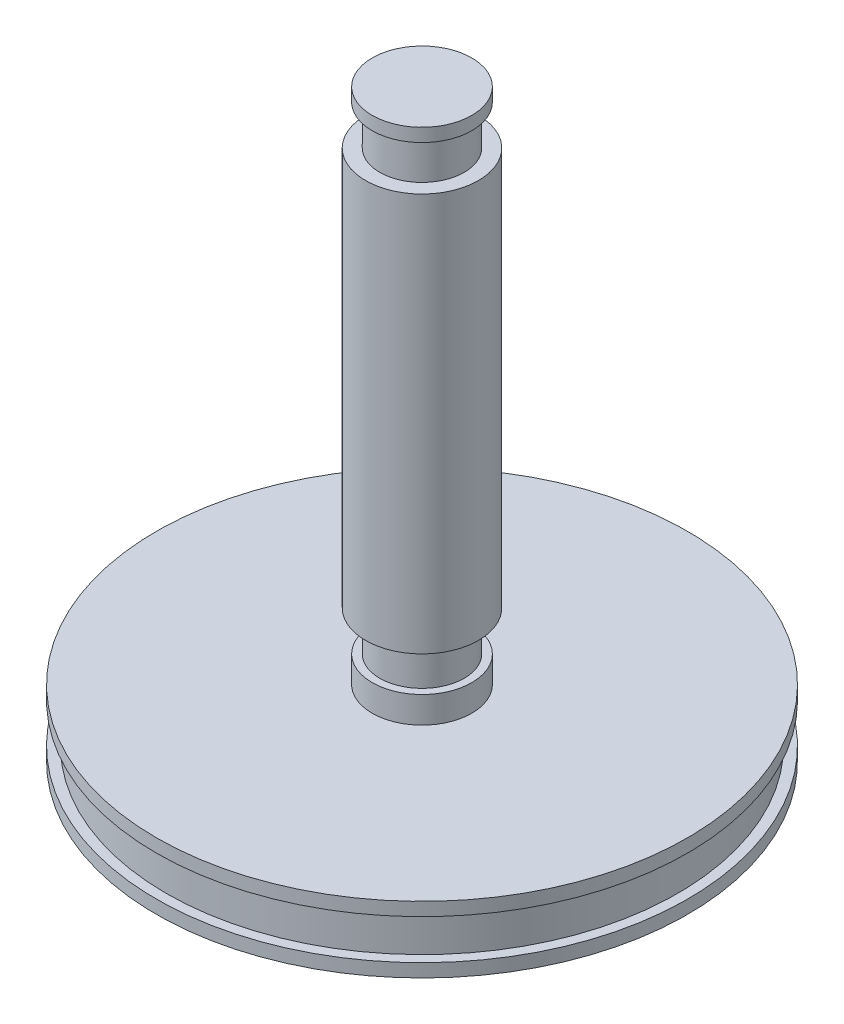
ISO-10303-21;
HEADER;
FILE_DESCRIPTION(('STEP AP214'),'2;1');
FILE_NAME('part.step','',(''),(''),'','','');
FILE_SCHEMA(('AUTOMOTIVE_DESIGN { 1 0 10303 214 1 1 1 1 }'));
ENDSEC;
DATA;
#1=APPLICATION_CONTEXT('core data for automotive mechanical design processes');
#2=APPLICATION_PROTOCOL_DEFINITION('international standard','automotive_design',2000,#1);
#3=PRODUCT_CONTEXT('',#1,'mechanical');
#4=PRODUCT('Part','Part','',(#3));
#5=PRODUCT_RELATED_PRODUCT_CATEGORY('part','',(#4));
#6=PRODUCT_DEFINITION_FORMATION('','',#4);
#7=PRODUCT_DEFINITION_CONTEXT('part definition',#1,'design');
#8=PRODUCT_DEFINITION('design','',#6,#7);
#9=PRODUCT_DEFINITION_SHAPE('','',#8);
#10=(LENGTH_UNIT() NAMED_UNIT(*) SI_UNIT(.MILLI.,.METRE.));
#11=(NAMED_UNIT(*) PLANE_ANGLE_UNIT() SI_UNIT($,.RADIAN.));
#12=(NAMED_UNIT(*) SI_UNIT($,.STERADIAN.) SOLID_ANGLE_UNIT());
#13=UNCERTAINTY_MEASURE_WITH_UNIT(LENGTH_MEASURE(1.E-05),#10,'distance_accuracy_value','');
#14=(GEOMETRIC_REPRESENTATION_CONTEXT(3) GLOBAL_UNCERTAINTY_ASSIGNED_CONTEXT((#13)) GLOBAL_UNIT_ASSIGNED_CONTEXT((#10,
#11,#12)) REPRESENTATION_CONTEXT('',''));
#15=CARTESIAN_POINT('',(0.,0.,0.));
#16=DIRECTION('',(0.,0.,1.));
#17=DIRECTION('',(1.,0.,0.));
#18=AXIS2_PLACEMENT_3D('',#15,#16,#17);
#19=CARTESIAN_POINT('',(0.,88.,0.));
#20=DIRECTION('',(0.,-1.,0.));
#21=DIRECTION('',(0.,0.,-1.));
#22=AXIS2_PLACEMENT_3D('',#19,#20,#21);
#23=CYLINDRICAL_SURFACE('',#22,6.366);
#24=CARTESIAN_POINT('',(0.,14.,0.));
#25=DIRECTION('',(0.,1.,0.));
#26=DIRECTION('',(0.,0.,1.));
#27=AXIS2_PLACEMENT_3D('',#24,#25,#26);
#28=CIRCLE('',#27,6.366);
#29=CARTESIAN_POINT('',(0.,14.,6.366));
#30=VERTEX_POINT('',#29);
#31=EDGE_CURVE('E36',#30,#30,#28,.T.);
#32=ORIENTED_EDGE('',*,*,#31,.T.);
#33=EDGE_LOOP('',(#32));
#34=FACE_BOUND('',#33,.T.);
#35=CARTESIAN_POINT('',(0.,20.,0.));
#36=DIRECTION('',(0.,-1.,0.));
#37=DIRECTION('',(0.,0.,-1.));
#38=AXIS2_PLACEMENT_3D('',#35,#36,#37);
#39=CIRCLE('',#38,6.366);
#40=CARTESIAN_POINT('',(0.,20.,-6.366));
#41=VERTEX_POINT('',#40);
#42=EDGE_CURVE('E48',#41,#41,#39,.T.);
#43=ORIENTED_EDGE('',*,*,#42,.T.);
#44=EDGE_LOOP('',(#43));
#45=FACE_BOUND('',#44,.T.);
#46=ADVANCED_FACE('F32',(#34,#45),#23,.T.);
#47=CARTESIAN_POINT('',(0.,20.,0.));
#48=DIRECTION('',(0.,1.,0.));
#49=DIRECTION('',(0.,0.,1.));
#50=AXIS2_PLACEMENT_3D('',#47,#48,#49);
#51=CYLINDRICAL_SURFACE('',#50,8.5);
#52=CARTESIAN_POINT('',(0.,20.,0.));
#53=DIRECTION('',(0.,-1.,0.));
#54=DIRECTION('',(0.,0.,-1.));
#55=AXIS2_PLACEMENT_3D('',#52,#53,#54);
#56=CIRCLE('',#55,8.5);
#57=CARTESIAN_POINT('',(0.,20.,-8.5));
#58=VERTEX_POINT('',#57);
#59=EDGE_CURVE('E51',#58,#58,#56,.T.);
#60=ORIENTED_EDGE('',*,*,#59,.F.);
#61=EDGE_LOOP('',(#60));
#62=FACE_BOUND('',#61,.T.);
#63=CARTESIAN_POINT('',(0.,80.,0.));
#64=DIRECTION('',(0.,-1.,0.));
#65=DIRECTION('',(0.,0.,-1.));
#66=AXIS2_PLACEMENT_3D('',#63,#64,#65);
#67=CIRCLE('',#66,8.5);
#68=CARTESIAN_POINT('',(0.,80.,-8.5));
#69=VERTEX_POINT('',#68);
#70=EDGE_CURVE('E58',#69,#69,#67,.T.);
#71=ORIENTED_EDGE('',*,*,#70,.T.);
#72=EDGE_LOOP('',(#71));
#73=FACE_BOUND('',#72,.T.);
#74=ADVANCED_FACE('F104',(#62,#73),#51,.T.);
#75=CARTESIAN_POINT('',(0.,20.,0.));
#76=DIRECTION('',(0.,-1.,0.));
#77=DIRECTION('',(0.,0.,-1.));
#78=AXIS2_PLACEMENT_3D('',#75,#76,#77);
#79=PLANE('',#78);
#80=ORIENTED_EDGE('',*,*,#42,.F.);
#81=EDGE_LOOP('',(#80));
#82=FACE_BOUND('',#81,.T.);
#83=ORIENTED_EDGE('',*,*,#59,.T.);
#84=EDGE_LOOP('',(#83));
#85=FACE_BOUND('',#84,.T.);
#86=ADVANCED_FACE('F111',(#82,#85),#79,.T.);
#87=CARTESIAN_POINT('',(0.,80.,0.));
#88=DIRECTION('',(0.,-1.,0.));
#89=DIRECTION('',(0.,0.,-1.));
#90=AXIS2_PLACEMENT_3D('',#87,#88,#89);
#91=PLANE('',#90);
#92=CARTESIAN_POINT('',(0.,80.,0.));
#93=DIRECTION('',(0.,-1.,0.));
#94=DIRECTION('',(0.,0.,-1.));
#95=AXIS2_PLACEMENT_3D('',#92,#93,#94);
#96=CIRCLE('',#95,6.366);
#97=CARTESIAN_POINT('',(0.,80.,-6.366));
#98=VERTEX_POINT('',#97);
#99=EDGE_CURVE('E10',#98,#98,#96,.T.);
#100=ORIENTED_EDGE('',*,*,#99,.T.);
#101=EDGE_LOOP('',(#100));
#102=FACE_BOUND('',#101,.T.);
#103=ORIENTED_EDGE('',*,*,#70,.F.);
#104=EDGE_LOOP('',(#103));
#105=FACE_BOUND('',#104,.T.);
#106=ADVANCED_FACE('F142',(#102,#105),#91,.F.);
#107=CARTESIAN_POINT('',(0.,88.,0.));
#108=DIRECTION('',(0.,1.,0.));
#109=DIRECTION('',(0.,0.,1.));
#110=AXIS2_PLACEMENT_3D('',#107,#108,#109);
#111=PLANE('',#110);
#112=CARTESIAN_POINT('',(0.,88.,0.));
#113=DIRECTION('',(0.,1.,0.));
#114=DIRECTION('',(0.,0.,1.));
#115=AXIS2_PLACEMENT_3D('',#112,#113,#114);
#116=CIRCLE('',#115,7.5);
#117=CARTESIAN_POINT('',(0.,88.,7.5));
#118=VERTEX_POINT('',#117);
#119=EDGE_CURVE('E50',#118,#118,#116,.T.);
#120=ORIENTED_EDGE('',*,*,#119,.T.);
#121=EDGE_LOOP('',(#120));
#122=FACE_BOUND('',#121,.T.);
#123=ADVANCED_FACE('F137',(#122),#111,.T.);
#124=CARTESIAN_POINT('',(0.,86.,0.));
#125=DIRECTION('',(0.,1.,0.));
#126=DIRECTION('',(0.,0.,1.));
#127=AXIS2_PLACEMENT_3D('',#124,#125,#126);
#128=CYLINDRICAL_SURFACE('',#127,7.5);
#129=CARTESIAN_POINT('',(0.,86.,0.));
#130=DIRECTION('',(0.,1.,0.));
#131=DIRECTION('',(0.,0.,1.));
#132=AXIS2_PLACEMENT_3D('',#129,#130,#131);
#133=CIRCLE('',#132,7.5);
#134=CARTESIAN_POINT('',(0.,86.,7.5));
#135=VERTEX_POINT('',#134);
#136=EDGE_CURVE('E55',#135,#135,#133,.T.);
#137=ORIENTED_EDGE('',*,*,#136,.T.);
#138=EDGE_LOOP('',(#137));
#139=FACE_BOUND('',#138,.T.);
#140=ORIENTED_EDGE('',*,*,#119,.F.);
#141=EDGE_LOOP('',(#140));
#142=FACE_BOUND('',#141,.T.);
#143=ADVANCED_FACE('F127',(#139,#142),#128,.T.);
#144=CARTESIAN_POINT('',(0.,86.,0.));
#145=DIRECTION('',(0.,1.,0.));
#146=DIRECTION('',(0.,0.,1.));
#147=AXIS2_PLACEMENT_3D('',#144,#145,#146);
#148=PLANE('',#147);
#149=CARTESIAN_POINT('',(0.,86.,0.));
#150=DIRECTION('',(0.,1.,0.));
#151=DIRECTION('',(0.,0.,1.));
#152=AXIS2_PLACEMENT_3D('',#149,#150,#151);
#153=CIRCLE('',#152,6.366);
#154=CARTESIAN_POINT('',(0.,86.,6.366));
#155=VERTEX_POINT('',#154);
#156=EDGE_CURVE('E40',#155,#155,#153,.T.);
#157=ORIENTED_EDGE('',*,*,#156,.T.);
#158=EDGE_LOOP('',(#157));
#159=FACE_BOUND('',#158,.T.);
#160=ORIENTED_EDGE('',*,*,#136,.F.);
#161=EDGE_LOOP('',(#160));
#162=FACE_BOUND('',#161,.T.);
#163=ADVANCED_FACE('F118',(#159,#162),#148,.F.);
#164=ORIENTED_EDGE('',*,*,#156,.F.);
#165=EDGE_LOOP('',(#164));
#166=FACE_BOUND('',#165,.T.);
#167=ORIENTED_EDGE('',*,*,#99,.F.);
#168=EDGE_LOOP('',(#167));
#169=FACE_BOUND('',#168,.T.);
#170=ADVANCED_FACE('F107',(#166,#169),#23,.T.);
#171=CARTESIAN_POINT('',(0.,14.,0.));
#172=DIRECTION('',(0.,-1.,0.));
#173=DIRECTION('',(0.,0.,-1.));
#174=AXIS2_PLACEMENT_3D('',#171,#172,#173);
#175=CYLINDRICAL_SURFACE('',#174,7.5);
#176=CARTESIAN_POINT('',(0.,14.,0.));
#177=DIRECTION('',(0.,1.,0.));
#178=DIRECTION('',(0.,0.,1.));
#179=AXIS2_PLACEMENT_3D('',#176,#177,#178);
#180=CIRCLE('',#179,7.5);
#181=CARTESIAN_POINT('',(0.,14.,7.5));
#182=VERTEX_POINT('',#181);
#183=EDGE_CURVE('E162',#182,#182,#180,.T.);
#184=ORIENTED_EDGE('',*,*,#183,.F.);
#185=EDGE_LOOP('',(#184));
#186=FACE_BOUND('',#185,.T.);
#187=CARTESIAN_POINT('',(0.,10.,0.));
#188=DIRECTION('',(0.,1.,0.));
#189=DIRECTION('',(0.,0.,1.));
#190=AXIS2_PLACEMENT_3D('',#187,#188,#189);
#191=CIRCLE('',#190,7.5);
#192=CARTESIAN_POINT('',(0.,10.,7.5));
#193=VERTEX_POINT('',#192);
#194=EDGE_CURVE('E65',#193,#193,#191,.T.);
#195=ORIENTED_EDGE('',*,*,#194,.T.);
#196=EDGE_LOOP('',(#195));
#197=FACE_BOUND('',#196,.T.);
#198=ADVANCED_FACE('F117',(#186,#197),#175,.T.);
#199=CARTESIAN_POINT('',(0.,14.,0.));
#200=DIRECTION('',(0.,1.,0.));
#201=DIRECTION('',(0.,0.,1.));
#202=AXIS2_PLACEMENT_3D('',#199,#200,#201);
#203=PLANE('',#202);
#204=ORIENTED_EDGE('',*,*,#31,.F.);
#205=EDGE_LOOP('',(#204));
#206=FACE_BOUND('',#205,.T.);
#207=ORIENTED_EDGE('',*,*,#183,.T.);
#208=EDGE_LOOP('',(#207));
#209=FACE_BOUND('',#208,.T.);
#210=ADVANCED_FACE('F124',(#206,#209),#203,.T.);
#211=CARTESIAN_POINT('',(0.,0.,0.));
#212=DIRECTION('',(0.,1.,0.));
#213=DIRECTION('',(0.,0.,1.));
#214=AXIS2_PLACEMENT_3D('',#211,#212,#213);
#215=PLANE('',#214);
#216=CARTESIAN_POINT('',(0.,0.,0.));
#217=DIRECTION('',(0.,-1.,0.));
#218=DIRECTION('',(0.,0.,-1.));
#219=AXIS2_PLACEMENT_3D('',#216,#217,#218);
#220=CIRCLE('',#219,40.);
#221=CARTESIAN_POINT('',(0.,0.,-40.));
#222=VERTEX_POINT('',#221);
#223=EDGE_CURVE('E74',#222,#222,#220,.T.);
#224=ORIENTED_EDGE('',*,*,#223,.T.);
#225=EDGE_LOOP('',(#224));
#226=FACE_BOUND('',#225,.T.);
#227=ADVANCED_FACE('F152',(#226),#215,.F.);
#228=CARTESIAN_POINT('',(0.,2.,0.));
#229=DIRECTION('',(0.,-1.,0.));
#230=DIRECTION('',(0.,0.,-1.));
#231=AXIS2_PLACEMENT_3D('',#228,#229,#230);
#232=CYLINDRICAL_SURFACE('',#231,40.);
#233=CARTESIAN_POINT('',(0.,2.,0.));
#234=DIRECTION('',(0.,-1.,0.));
#235=DIRECTION('',(0.,0.,-1.));
#236=AXIS2_PLACEMENT_3D('',#233,#234,#235);
#237=CIRCLE('',#236,40.);
#238=CARTESIAN_POINT('',(0.,2.,-40.));
#239=VERTEX_POINT('',#238);
#240=EDGE_CURVE('E77',#239,#239,#237,.T.);
#241=ORIENTED_EDGE('',*,*,#240,.T.);
#242=EDGE_LOOP('',(#241));
#243=FACE_BOUND('',#242,.T.);
#244=ORIENTED_EDGE('',*,*,#223,.F.);
#245=EDGE_LOOP('',(#244));
#246=FACE_BOUND('',#245,.T.);
#247=ADVANCED_FACE('F99',(#243,#246),#232,.T.);
#248=CARTESIAN_POINT('',(0.,2.,0.));
#249=DIRECTION('',(0.,-1.,0.));
#250=DIRECTION('',(0.,0.,-1.));
#251=AXIS2_PLACEMENT_3D('',#248,#249,#250);
#252=PLANE('',#251);
#253=CARTESIAN_POINT('',(0.,2.,0.));
#254=DIRECTION('',(0.,-1.,0.));
#255=DIRECTION('',(0.,0.,-1.));
#256=AXIS2_PLACEMENT_3D('',#253,#254,#255);
#257=CIRCLE('',#256,38.515);
#258=CARTESIAN_POINT('',(0.,2.,-38.515));
#259=VERTEX_POINT('',#258);
#260=EDGE_CURVE('E80',#259,#259,#257,.T.);
#261=ORIENTED_EDGE('',*,*,#260,.T.);
#262=EDGE_LOOP('',(#261));
#263=FACE_BOUND('',#262,.T.);
#264=ORIENTED_EDGE('',*,*,#240,.F.);
#265=EDGE_LOOP('',(#264));
#266=FACE_BOUND('',#265,.T.);
#267=ADVANCED_FACE('F91',(#263,#266),#252,.F.);
#268=CARTESIAN_POINT('',(0.,10.,0.));
#269=DIRECTION('',(0.,-1.,0.));
#270=DIRECTION('',(0.,0.,-1.));
#271=AXIS2_PLACEMENT_3D('',#268,#269,#270);
#272=CYLINDRICAL_SURFACE('',#271,38.515);
#273=ORIENTED_EDGE('',*,*,#260,.F.);
#274=EDGE_LOOP('',(#273));
#275=FACE_BOUND('',#274,.T.);
#276=CARTESIAN_POINT('',(0.,8.,0.));
#277=DIRECTION('',(0.,1.,0.));
#278=DIRECTION('',(0.,0.,1.));
#279=AXIS2_PLACEMENT_3D('',#276,#277,#278);
#280=CIRCLE('',#279,38.515);
#281=CARTESIAN_POINT('',(0.,8.,38.515));
#282=VERTEX_POINT('',#281);
#283=EDGE_CURVE('E45',#282,#282,#280,.T.);
#284=ORIENTED_EDGE('',*,*,#283,.F.);
#285=EDGE_LOOP('',(#284));
#286=FACE_BOUND('',#285,.T.);
#287=ADVANCED_FACE('F34',(#275,#286),#272,.T.);
#288=CARTESIAN_POINT('',(0.,8.,0.));
#289=DIRECTION('',(0.,1.,0.));
#290=DIRECTION('',(0.,0.,1.));
#291=AXIS2_PLACEMENT_3D('',#288,#289,#290);
#292=PLANE('',#291);
#293=ORIENTED_EDGE('',*,*,#283,.T.);
#294=EDGE_LOOP('',(#293));
#295=FACE_BOUND('',#294,.T.);
#296=CARTESIAN_POINT('',(0.,8.,0.));
#297=DIRECTION('',(0.,1.,0.));
#298=DIRECTION('',(0.,0.,1.));
#299=AXIS2_PLACEMENT_3D('',#296,#297,#298);
#300=CIRCLE('',#299,40.);
#301=CARTESIAN_POINT('',(0.,8.,40.));
#302=VERTEX_POINT('',#301);
#303=EDGE_CURVE('E71',#302,#302,#300,.T.);
#304=ORIENTED_EDGE('',*,*,#303,.F.);
#305=EDGE_LOOP('',(#304));
#306=FACE_BOUND('',#305,.T.);
#307=ADVANCED_FACE('F87',(#295,#306),#292,.F.);
#308=CARTESIAN_POINT('',(0.,8.,0.));
#309=DIRECTION('',(0.,1.,0.));
#310=DIRECTION('',(0.,0.,1.));
#311=AXIS2_PLACEMENT_3D('',#308,#309,#310);
#312=CYLINDRICAL_SURFACE('',#311,40.);
#313=ORIENTED_EDGE('',*,*,#303,.T.);
#314=EDGE_LOOP('',(#313));
#315=FACE_BOUND('',#314,.T.);
#316=CARTESIAN_POINT('',(0.,10.,0.));
#317=DIRECTION('',(0.,1.,0.));
#318=DIRECTION('',(0.,0.,1.));
#319=AXIS2_PLACEMENT_3D('',#316,#317,#318);
#320=CIRCLE('',#319,40.);
#321=CARTESIAN_POINT('',(0.,10.,40.));
#322=VERTEX_POINT('',#321);
#323=EDGE_CURVE('E69',#322,#322,#320,.T.);
#324=ORIENTED_EDGE('',*,*,#323,.F.);
#325=EDGE_LOOP('',(#324));
#326=FACE_BOUND('',#325,.T.);
#327=ADVANCED_FACE('F97',(#315,#326),#312,.T.);
#328=CARTESIAN_POINT('',(0.,10.,0.));
#329=DIRECTION('',(0.,1.,0.));
#330=DIRECTION('',(0.,0.,1.));
#331=AXIS2_PLACEMENT_3D('',#328,#329,#330);
#332=PLANE('',#331);
#333=ORIENTED_EDGE('',*,*,#194,.F.);
#334=EDGE_LOOP('',(#333));
#335=FACE_BOUND('',#334,.T.);
#336=ORIENTED_EDGE('',*,*,#323,.T.);
#337=EDGE_LOOP('',(#336));
#338=FACE_BOUND('',#337,.T.);
#339=ADVANCED_FACE('F167',(#335,#338),#332,.T.);
#340=CLOSED_SHELL('',(#46,#74,#86,#106,#123,#143,#163,#170,#198,#210,#227,#247,#267,#287,#307,
#327,#339));
#341=MANIFOLD_SOLID_BREP('B2',#340);
#342=ADVANCED_BREP_SHAPE_REPRESENTATION('',(#18,#341),#14);
#343=SHAPE_DEFINITION_REPRESENTATION(#9,#342);
ENDSEC;
END-ISO-10303-21;
